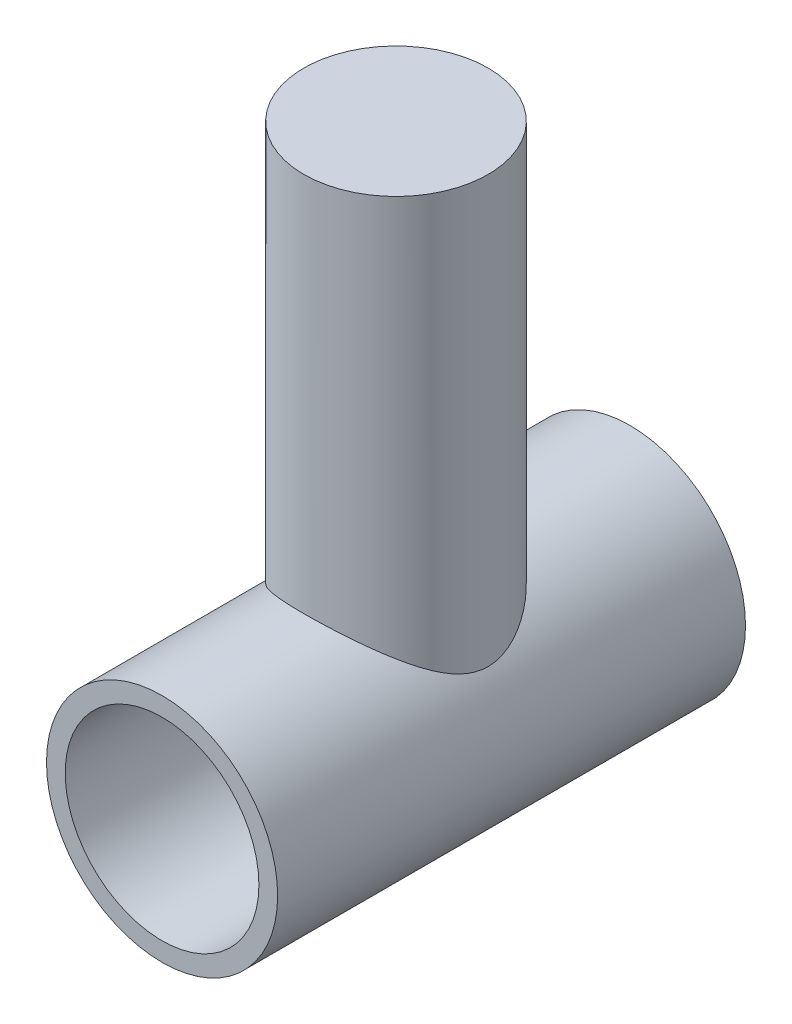
ISO-10303-21;
HEADER;
FILE_DESCRIPTION(('STEP AP214'),'2;1');
FILE_NAME('part.step','',(''),(''),'','','');
FILE_SCHEMA(('AUTOMOTIVE_DESIGN { 1 0 10303 214 1 1 1 1 }'));
ENDSEC;
DATA;
#1=APPLICATION_CONTEXT('core data for automotive mechanical design processes');
#2=APPLICATION_PROTOCOL_DEFINITION('international standard','automotive_design',2000,#1);
#3=PRODUCT_CONTEXT('',#1,'mechanical');
#4=PRODUCT('Part','Part','',(#3));
#5=PRODUCT_RELATED_PRODUCT_CATEGORY('part','',(#4));
#6=PRODUCT_DEFINITION_FORMATION('','',#4);
#7=PRODUCT_DEFINITION_CONTEXT('part definition',#1,'design');
#8=PRODUCT_DEFINITION('design','',#6,#7);
#9=PRODUCT_DEFINITION_SHAPE('','',#8);
#10=(LENGTH_UNIT() NAMED_UNIT(*) SI_UNIT(.MILLI.,.METRE.));
#11=(NAMED_UNIT(*) PLANE_ANGLE_UNIT() SI_UNIT($,.RADIAN.));
#12=(NAMED_UNIT(*) SI_UNIT($,.STERADIAN.) SOLID_ANGLE_UNIT());
#13=UNCERTAINTY_MEASURE_WITH_UNIT(LENGTH_MEASURE(1.E-05),#10,'distance_accuracy_value','');
#14=(GEOMETRIC_REPRESENTATION_CONTEXT(3) GLOBAL_UNCERTAINTY_ASSIGNED_CONTEXT((#13)) GLOBAL_UNIT_ASSIGNED_CONTEXT((#10,
#11,#12)) REPRESENTATION_CONTEXT('',''));
#15=CARTESIAN_POINT('',(0.,0.,0.));
#16=DIRECTION('',(0.,0.,1.));
#17=DIRECTION('',(1.,0.,0.));
#18=AXIS2_PLACEMENT_3D('',#15,#16,#17);
#19=CARTESIAN_POINT('',(0.,0.,50.));
#20=DIRECTION('',(0.,0.,-1.));
#21=DIRECTION('',(-1.,0.,0.));
#22=AXIS2_PLACEMENT_3D('',#19,#20,#21);
#23=CYLINDRICAL_SURFACE('',#22,12.35);
#24=CARTESIAN_POINT('',(0.,0.,0.));
#25=DIRECTION('',(0.,0.,1.));
#26=DIRECTION('',(1.,0.,0.));
#27=AXIS2_PLACEMENT_3D('',#24,#25,#26);
#28=CIRCLE('',#27,12.35);
#29=CARTESIAN_POINT('',(12.35,0.,0.));
#30=VERTEX_POINT('',#29);
#31=EDGE_CURVE('E47',#30,#30,#28,.T.);
#32=ORIENTED_EDGE('',*,*,#31,.T.);
#33=EDGE_LOOP('',(#32));
#34=FACE_BOUND('',#33,.T.);
#35=CARTESIAN_POINT('',(0.,0.,50.));
#36=DIRECTION('',(0.,0.,1.));
#37=DIRECTION('',(1.,0.,0.));
#38=AXIS2_PLACEMENT_3D('',#35,#36,#37);
#39=CIRCLE('',#38,12.35);
#40=CARTESIAN_POINT('',(12.35,0.,50.));
#41=VERTEX_POINT('',#40);
#42=EDGE_CURVE('E10',#41,#41,#39,.T.);
#43=ORIENTED_EDGE('',*,*,#42,.F.);
#44=EDGE_LOOP('',(#43));
#45=FACE_BOUND('',#44,.T.);
#46=CARTESIAN_POINT('',(-5.61449018166385,11.,16.9067929718807));
#47=CARTESIAN_POINT('',(-5.42529884462076,11.0965659191059,16.775545593569));
#48=CARTESIAN_POINT('',(-5.23040180942077,11.189887363234,16.6501642091318));
#49=CARTESIAN_POINT('',(-4.82956744128013,11.3686369387872,16.4120963111281));
#50=CARTESIAN_POINT('',(-4.62363254186824,11.4540667988581,16.2994070161772));
#51=CARTESIAN_POINT('',(-4.20106512415321,11.6157123763994,16.0876797902694));
#52=CARTESIAN_POINT('',(-3.98442183374415,11.6919185382293,15.9886560019802));
#53=CARTESIAN_POINT('',(-3.54159783676067,11.8335788622985,15.805602377793));
#54=CARTESIAN_POINT('',(-3.31542173211603,11.899038139508,15.7215654072805));
#55=CARTESIAN_POINT('',(-2.85282311895951,12.01837724565,15.5690049152559));
#56=CARTESIAN_POINT('',(-2.61633454077865,12.0721629442987,15.5006072818591));
#57=CARTESIAN_POINT('',(-2.13634196467337,12.1662789617796,15.3812843903192));
#58=CARTESIAN_POINT('',(-1.89283785732801,12.2066090706219,15.3303594048565));
#59=CARTESIAN_POINT('',(-1.40097559945029,12.2727862032871,15.246953011403));
#60=CARTESIAN_POINT('',(-1.15262221851111,12.2986467828771,15.214454340352));
#61=CARTESIAN_POINT('',(-0.653063901700054,12.3352627249628,15.1684740728923));
#62=CARTESIAN_POINT('',(-0.401859289439666,12.3460197847457,15.1549903396425));
#63=CARTESIAN_POINT('',(0.075055382102793,12.3518316615819,15.1477035699446));
#64=CARTESIAN_POINT('',(0.300721546142662,12.3483921513447,15.1520133832037));
#65=CARTESIAN_POINT('',(0.750692025383289,12.3292197570843,15.1760642526019));
#66=CARTESIAN_POINT('',(0.974996434738754,12.3134877329768,15.1958042293327));
#67=CARTESIAN_POINT('',(1.42066414387696,12.2700598226745,15.2504030333168));
#68=CARTESIAN_POINT('',(1.64202624918778,12.2423592218842,15.2852678184726));
#69=CARTESIAN_POINT('',(2.08019498335459,12.1755659376409,15.3695759635973));
#70=CARTESIAN_POINT('',(2.29700160632332,12.1364732394663,15.4190193424054));
#71=CARTESIAN_POINT('',(2.72016574135288,12.0486059018783,15.5305724290574));
#72=CARTESIAN_POINT('',(2.9266474929623,12.0000555669163,15.5923894654104));
#73=CARTESIAN_POINT('',(3.33303462695444,11.893591701106,15.728574698424));
#74=CARTESIAN_POINT('',(3.53293722524407,11.835674266177,15.8029481289898));
#75=CARTESIAN_POINT('',(3.92500871561237,11.711492068565,15.9633182321825));
#76=CARTESIAN_POINT('',(4.11718698907807,11.6452378617705,16.049300216116));
#77=CARTESIAN_POINT('',(4.4934737090355,11.5052809735013,16.2321636608777));
#78=CARTESIAN_POINT('',(4.67758190279591,11.4315780589934,16.3290454627179));
#79=CARTESIAN_POINT('',(4.98821381301977,11.2986932263354,16.5051289948805));
#80=CARTESIAN_POINT('',(5.11675139651109,11.2410312683206,16.5819489474599));
#81=CARTESIAN_POINT('',(5.3691359662743,11.1226930685172,16.740636198292));
#82=CARTESIAN_POINT('',(5.4929850338618,11.0620181925379,16.8225012135127));
#83=CARTESIAN_POINT('',(5.86640750597774,10.8714173234177,17.0815555610705));
#84=CARTESIAN_POINT('',(6.10824926414197,10.7370602705407,17.2667497406506));
#85=CARTESIAN_POINT('',(6.57126706604069,10.4601061850695,17.6561197039602));
#86=CARTESIAN_POINT('',(6.79242620450919,10.3175025634376,17.8603107478169));
#87=CARTESIAN_POINT('',(7.21449290029259,10.0269369222686,18.2870281907644));
#88=CARTESIAN_POINT('',(7.41532006274657,9.87895655222747,18.5096215033638));
#89=CARTESIAN_POINT('',(7.79549632220498,9.58180049758493,18.9715500809506));
#90=CARTESIAN_POINT('',(7.97485281378527,9.43262524350009,19.2108795367034));
#91=CARTESIAN_POINT('',(8.28514863001835,9.16048109872716,19.6668633848377));
#92=CARTESIAN_POINT('',(8.41925931118433,9.03709839716757,19.8811187778695));
#93=CARTESIAN_POINT('',(8.67167705583788,8.79517274563727,20.32143797873));
#94=CARTESIAN_POINT('',(8.78998204648384,8.67663043187328,20.5475033299817));
#95=CARTESIAN_POINT('',(9.00976961553187,8.4481714937969,21.0110014515098));
#96=CARTESIAN_POINT('',(9.11129845921537,8.33823160256654,21.2484005502611));
#97=CARTESIAN_POINT('',(9.2968026055839,8.13088541143018,21.735060765016));
#98=CARTESIAN_POINT('',(9.38078738701135,8.0334723544937,21.9843153858544));
#99=CARTESIAN_POINT('',(9.55344442629555,7.82799846153984,22.5758512110564));
#100=CARTESIAN_POINT('',(9.6351691777975,7.72634478877676,22.9225826719001));
#101=CARTESIAN_POINT('',(9.72966898779226,7.60648489792978,23.4545186059697));
#102=CARTESIAN_POINT('',(9.75647995973291,7.5719794032434,23.6336917288806));
#103=CARTESIAN_POINT('',(9.80030538727324,7.51517231277142,23.9952015899878));
#104=CARTESIAN_POINT('',(9.81732004499943,7.49287046518949,24.177538262831));
#105=CARTESIAN_POINT('',(9.84124327666032,7.46142283978527,24.5453986679092));
#106=CARTESIAN_POINT('',(9.84807500198733,7.45237711183478,24.7309360508201));
#107=CARTESIAN_POINT('',(9.85121875238018,7.44822105202997,25.1022539392181));
#108=CARTESIAN_POINT('',(9.84753111137066,7.45311027782729,25.2880344368008));
#109=CARTESIAN_POINT('',(9.82972292371484,7.47658073138786,25.6583659380241));
#110=CARTESIAN_POINT('',(9.81559377474572,7.49517324868756,25.8429158012263));
#111=CARTESIAN_POINT('',(9.7772315604325,7.54514574390534,26.2092039299484));
#112=CARTESIAN_POINT('',(9.75299701198259,7.57652759881858,26.3909417787046));
#113=CARTESIAN_POINT('',(9.68918717803045,7.65802390164149,26.7859690604752));
#114=CARTESIAN_POINT('',(9.64752870381873,7.71061251098807,26.9984101252857));
#115=CARTESIAN_POINT('',(9.55137654523761,7.82940155713996,27.4165686203542));
#116=CARTESIAN_POINT('',(9.49687286017239,7.89561259461971,27.6222806688744));
#117=CARTESIAN_POINT('',(9.37578743879014,8.03902556419913,28.0268514456266));
#118=CARTESIAN_POINT('',(9.30917125652375,8.11625870301635,28.2256886526426));
#119=CARTESIAN_POINT('',(9.16475977520799,8.27898061366293,28.6156469068967));
#120=CARTESIAN_POINT('',(9.08696748271421,8.36446716316837,28.8067700116978));
#121=CARTESIAN_POINT('',(8.88139509810945,8.58342972114174,29.2701970521377));
#122=CARTESIAN_POINT('',(8.74739034027204,8.72045779817416,29.5380757626032));
#123=CARTESIAN_POINT('',(8.45754606253556,9.00184914896008,30.0577651817319));
#124=CARTESIAN_POINT('',(8.30169507878854,9.14621624836494,30.3095673525731));
#125=CARTESIAN_POINT('',(7.96912408469236,9.43739060921457,30.7967571532569));
#126=CARTESIAN_POINT('',(7.79243729105854,9.58419367451584,31.0321699831371));
#127=CARTESIAN_POINT('',(7.4184324170484,9.87652169598166,31.4865936444383));
#128=CARTESIAN_POINT('',(7.2211253234151,10.0220472884435,31.7056131047536));
#129=CARTESIAN_POINT('',(6.80160119511423,10.3115006041123,32.1310476111339));
#130=CARTESIAN_POINT('',(6.57894610715368,10.4553296843256,32.3370988034759));
#131=CARTESIAN_POINT('',(6.11245453381482,10.7347234013807,32.730029316295));
#132=CARTESIAN_POINT('',(5.86861974304087,10.8702886979399,32.9169101680013));
#133=CARTESIAN_POINT('',(5.42529884462077,11.0965659191059,33.224454406431));
#134=CARTESIAN_POINT('',(5.23040180942078,11.1898873632339,33.3498357908682));
#135=CARTESIAN_POINT('',(4.82956744128014,11.3686369387872,33.5879036888719));
#136=CARTESIAN_POINT('',(4.62363254186826,11.4540667988581,33.7005929838228));
#137=CARTESIAN_POINT('',(4.20106512415323,11.6157123763994,33.9123202097306));
#138=CARTESIAN_POINT('',(3.98442183374416,11.6919185382293,34.0113439980198));
#139=CARTESIAN_POINT('',(3.54159783676069,11.8335788622985,34.194397622207));
#140=CARTESIAN_POINT('',(3.31542173211605,11.899038139508,34.2784345927195));
#141=CARTESIAN_POINT('',(2.85282311895952,12.01837724565,34.4309950847441));
#142=CARTESIAN_POINT('',(2.61633454077867,12.0721629442987,34.4993927181409));
#143=CARTESIAN_POINT('',(2.13634196467339,12.1662789617796,34.6187156096808));
#144=CARTESIAN_POINT('',(1.89283785732803,12.2066090706219,34.6696405951435));
#145=CARTESIAN_POINT('',(1.4009755994503,12.2727862032871,34.753046988597));
#146=CARTESIAN_POINT('',(1.15262221851113,12.2986467828771,34.785545659648));
#147=CARTESIAN_POINT('',(0.653063901700069,12.3352627249628,34.8315259271077));
#148=CARTESIAN_POINT('',(0.401859289439681,12.3460197847457,34.8450096603575));
#149=CARTESIAN_POINT('',(-0.0750553821027777,12.3518316615819,34.8522964300554));
#150=CARTESIAN_POINT('',(-0.300721546142647,12.3483921513447,34.8479866167963));
#151=CARTESIAN_POINT('',(-0.750692025383275,12.3292197570843,34.8239357473981));
#152=CARTESIAN_POINT('',(-0.974996434738739,12.3134877329768,34.8041957706673));
#153=CARTESIAN_POINT('',(-1.42066414387695,12.2700598226745,34.7495969666833));
#154=CARTESIAN_POINT('',(-1.64202624918777,12.2423592218842,34.7147321815274));
#155=CARTESIAN_POINT('',(-2.08019498335458,12.1755659376409,34.6304240364027));
#156=CARTESIAN_POINT('',(-2.29700160632331,12.1364732394663,34.5809806575946));
#157=CARTESIAN_POINT('',(-2.72016574135287,12.0486059018783,34.4694275709426));
#158=CARTESIAN_POINT('',(-2.92664749296229,12.0000555669163,34.4076105345896));
#159=CARTESIAN_POINT('',(-3.33303462695443,11.893591701106,34.271425301576));
#160=CARTESIAN_POINT('',(-3.53293722524406,11.835674266177,34.1970518710102));
#161=CARTESIAN_POINT('',(-3.92500871561236,11.711492068565,34.0366817678175));
#162=CARTESIAN_POINT('',(-4.11718698907806,11.6452378617705,33.950699783884));
#163=CARTESIAN_POINT('',(-4.49347370903549,11.5052809735013,33.7678363391224));
#164=CARTESIAN_POINT('',(-4.6775819027959,11.4315780589934,33.6709545372822));
#165=CARTESIAN_POINT('',(-4.98821381301976,11.2986932263354,33.4948710051195));
#166=CARTESIAN_POINT('',(-5.11675139651108,11.2410312683206,33.4180510525401));
#167=CARTESIAN_POINT('',(-5.36913596627429,11.1226930685172,33.259363801708));
#168=CARTESIAN_POINT('',(-5.49298503386178,11.0620181925379,33.1774987864873));
#169=CARTESIAN_POINT('',(-5.86640750597773,10.8714173234177,32.9184444389295));
#170=CARTESIAN_POINT('',(-6.10824926414196,10.7370602705407,32.7332502593494));
#171=CARTESIAN_POINT('',(-6.57126706604068,10.4601061850695,32.3438802960398));
#172=CARTESIAN_POINT('',(-6.79242620450918,10.3175025634376,32.1396892521831));
#173=CARTESIAN_POINT('',(-7.21449290029259,10.0269369222686,31.7129718092356));
#174=CARTESIAN_POINT('',(-7.41532006274657,9.87895655222747,31.4903784966363));
#175=CARTESIAN_POINT('',(-7.79549632220498,9.58180049758493,31.0284499190494));
#176=CARTESIAN_POINT('',(-7.97485281378527,9.43262524350009,30.7891204632966));
#177=CARTESIAN_POINT('',(-8.28514863001835,9.16048109872716,30.3331366151623));
#178=CARTESIAN_POINT('',(-8.41925931118433,9.03709839716757,30.1188812221305));
#179=CARTESIAN_POINT('',(-8.67167705583788,8.79517274563727,29.67856202127));
#180=CARTESIAN_POINT('',(-8.78998204648383,8.67663043187328,29.4524966700183));
#181=CARTESIAN_POINT('',(-9.00976961553187,8.4481714937969,28.9889985484902));
#182=CARTESIAN_POINT('',(-9.11129845921537,8.33823160256655,28.7515994497389));
#183=CARTESIAN_POINT('',(-9.29680260558389,8.13088541143018,28.264939234984));
#184=CARTESIAN_POINT('',(-9.38078738701135,8.0334723544937,28.0156846141456));
#185=CARTESIAN_POINT('',(-9.55344442629555,7.82799846153984,27.4241487889436));
#186=CARTESIAN_POINT('',(-9.6351691777975,7.72634478877676,27.0774173280999));
#187=CARTESIAN_POINT('',(-9.72966898779226,7.60648489792978,26.5454813940303));
#188=CARTESIAN_POINT('',(-9.75647995973291,7.5719794032434,26.3663082711194));
#189=CARTESIAN_POINT('',(-9.80030538727324,7.51517231277142,26.0047984100122));
#190=CARTESIAN_POINT('',(-9.81732004499943,7.49287046518949,25.822461737169));
#191=CARTESIAN_POINT('',(-9.84124327666032,7.46142283978527,25.4546013320907));
#192=CARTESIAN_POINT('',(-9.84807500198733,7.45237711183478,25.2690639491799));
#193=CARTESIAN_POINT('',(-9.85121875238018,7.44822105202997,24.8977460607819));
#194=CARTESIAN_POINT('',(-9.84753111137066,7.45311027782729,24.7119655631992));
#195=CARTESIAN_POINT('',(-9.82972292371483,7.47658073138786,24.3416340619759));
#196=CARTESIAN_POINT('',(-9.81559377474572,7.49517324868756,24.1570841987737));
#197=CARTESIAN_POINT('',(-9.7772315604325,7.54514574390534,23.7907960700516));
#198=CARTESIAN_POINT('',(-9.75299701198259,7.57652759881858,23.6090582212954));
#199=CARTESIAN_POINT('',(-9.68918717803045,7.65802390164149,23.2140309395248));
#200=CARTESIAN_POINT('',(-9.64752870381873,7.71061251098807,23.0015898747142));
#201=CARTESIAN_POINT('',(-9.55137654523761,7.82940155713997,22.5834313796458));
#202=CARTESIAN_POINT('',(-9.49687286017239,7.89561259461971,22.3777193311256));
#203=CARTESIAN_POINT('',(-9.37578743879014,8.03902556419913,21.9731485543734));
#204=CARTESIAN_POINT('',(-9.30917125652375,8.11625870301636,21.7743113473574));
#205=CARTESIAN_POINT('',(-9.16475977520799,8.27898061366293,21.3843530931033));
#206=CARTESIAN_POINT('',(-9.08696748271421,8.36446716316837,21.1932299883022));
#207=CARTESIAN_POINT('',(-8.88139509810945,8.58342972114174,20.7298029478623));
#208=CARTESIAN_POINT('',(-8.74739034027204,8.72045779817416,20.4619242373968));
#209=CARTESIAN_POINT('',(-8.45754606253556,9.00184914896009,19.9422348182681));
#210=CARTESIAN_POINT('',(-8.30169507878854,9.14621624836495,19.6904326474269));
#211=CARTESIAN_POINT('',(-7.96912408469236,9.43739060921458,19.2032428467431));
#212=CARTESIAN_POINT('',(-7.79243729105853,9.58419367451584,18.9678300168629));
#213=CARTESIAN_POINT('',(-7.4184324170484,9.87652169598167,18.5134063555617));
#214=CARTESIAN_POINT('',(-7.22112532341509,10.0220472884435,18.2943868952464));
#215=CARTESIAN_POINT('',(-6.80160119511422,10.3115006041123,17.8689523888661));
#216=CARTESIAN_POINT('',(-6.57894610715367,10.4553296843256,17.6629011965241));
#217=CARTESIAN_POINT('',(-6.11245453381481,10.7347234013807,17.269970683705));
#218=CARTESIAN_POINT('',(-5.86861974304086,10.8702886979399,17.0830898319987));
#219=CARTESIAN_POINT('',(-5.61449018166385,11.,16.9067929718807));
#220=B_SPLINE_CURVE_WITH_KNOTS('',3,(#46,#47,#48,#49,#50,#51,#52,#53,#54,#55,#56,#57,#58,#59,
#60,#61,#62,#63,#64,#65,#66,#67,#68,#69,#70,#71,#72,#73,#74,#75,#76,#77,#78,#79,#80,#81,#82,#83,
#84,#85,#86,#87,#88,#89,#90,#91,#92,#93,#94,#95,#96,#97,#98,#99,#100,#101,#102,#103,#104,#105,
#106,#107,#108,#109,#110,#111,#112,#113,#114,#115,#116,#117,#118,#119,#120,#121,#122,#123,#124,
#125,#126,#127,#128,#129,#130,#131,#132,#133,#134,#135,#136,#137,#138,#139,#140,#141,#142,#143,
#144,#145,#146,#147,#148,#149,#150,#151,#152,#153,#154,#155,#156,#157,#158,#159,#160,#161,#162,
#163,#164,#165,#166,#167,#168,#169,#170,#171,#172,#173,#174,#175,#176,#177,#178,#179,#180,#181,
#182,#183,#184,#185,#186,#187,#188,#189,#190,#191,#192,#193,#194,#195,#196,#197,#198,#199,#200,
#201,#202,#203,#204,#205,#206,#207,#208,#209,#210,#211,#212,#213,#214,#215,#216,#217,#218,#219),
.UNSPECIFIED.,.T.,.F.,(4,2,2,2,2,2,2,2,2,2,2,2,2,2,2,2,2,2,2,2,2,2,2,2,2,2,2,2,2,2,2,2,2,2,2,2,
2,2,2,2,2,2,2,2,2,2,2,2,2,2,2,2,2,2,2,2,2,2,2,2,2,2,2,2,2,2,2,2,2,2,2,2,2,2,2,2,2,2,2,2,2,2,2,2,
2,2,4),(0.,0.748864202000455,1.49756397491848,2.24703287067838,2.99614401675382,
3.75108800625278,4.50604377696533,5.26029107860815,6.01445361346753,6.69079963461533,
7.36709834659653,8.04366370564661,8.7202299390004,9.38236485466179,10.044776453776,
10.7063576021973,11.3679594546272,11.8491709001829,12.3301661607638,13.3274164110213,
14.3254747827717,15.3273369383949,16.3288530503148,17.1719965690461,18.0152505537507,
18.8561387287419,19.6965714051281,20.803315462581,21.356019083971,21.9087113010655,
22.4655538254577,23.02237867375,23.5796627789435,24.1370287020161,24.8043481238251,
25.4721888165155,26.1419593190841,26.8115499787048,27.7982865032008,28.785542771545,
29.7712458958153,30.7564264776548,31.762411995317,32.7683170973141,33.5171812993146,
34.2658810722326,35.0153499679925,35.7644611140679,36.5194051035669,37.2743608742794,
38.0286081759223,38.7827707107816,39.4591167319294,40.1354154439106,40.8119808029607,
41.4885470363145,42.1506819519759,42.8130935510901,43.4746746995114,44.1362765519413,
44.617487997497,45.0984832580779,46.0957335083354,47.0937918800858,48.095654035709,
49.0971701476289,49.9403136663602,50.7835676510648,51.624455826056,52.4648885024422,
53.5716325598951,54.1243361812851,54.6770283983797,55.2338709227718,55.7906957710641,
56.3479798762576,56.9053457993302,57.5726652211392,58.2405059138296,58.9102764163982,
59.5798670760189,60.5666036005149,61.5538598688592,62.5395629931294,63.524743574969,
64.5307290926311,65.5366341946282),.UNSPECIFIED.);
#221=CARTESIAN_POINT('',(-5.61449018166385,11.,16.9067929718807));
#222=VERTEX_POINT('',#221);
#223=EDGE_CURVE('E62',#222,#222,#220,.T.);
#224=ORIENTED_EDGE('',*,*,#223,.T.);
#225=EDGE_LOOP('',(#224));
#226=FACE_BOUND('',#225,.T.);
#227=ADVANCED_FACE('F43',(#34,#45,#226),#23,.T.);
#228=CARTESIAN_POINT('',(0.,0.,50.));
#229=DIRECTION('',(0.,0.,-1.));
#230=DIRECTION('',(-1.,0.,0.));
#231=AXIS2_PLACEMENT_3D('',#228,#229,#230);
#232=CYLINDRICAL_SURFACE('',#231,10.35);
#233=CARTESIAN_POINT('',(0.,0.,50.));
#234=DIRECTION('',(0.,0.,1.));
#235=DIRECTION('',(1.,0.,0.));
#236=AXIS2_PLACEMENT_3D('',#233,#234,#235);
#237=CIRCLE('',#236,10.35);
#238=CARTESIAN_POINT('',(10.35,0.,50.));
#239=VERTEX_POINT('',#238);
#240=EDGE_CURVE('E56',#239,#239,#237,.T.);
#241=ORIENTED_EDGE('',*,*,#240,.T.);
#242=EDGE_LOOP('',(#241));
#243=FACE_BOUND('',#242,.T.);
#244=CARTESIAN_POINT('',(0.,0.,0.));
#245=DIRECTION('',(0.,0.,1.));
#246=DIRECTION('',(1.,0.,0.));
#247=AXIS2_PLACEMENT_3D('',#244,#245,#246);
#248=CIRCLE('',#247,10.35);
#249=CARTESIAN_POINT('',(10.35,0.,0.));
#250=VERTEX_POINT('',#249);
#251=EDGE_CURVE('E58',#250,#250,#248,.T.);
#252=ORIENTED_EDGE('',*,*,#251,.F.);
#253=EDGE_LOOP('',(#252));
#254=FACE_BOUND('',#253,.T.);
#255=ADVANCED_FACE('F82',(#243,#254),#232,.F.);
#256=CARTESIAN_POINT('',(0.,0.,50.));
#257=DIRECTION('',(0.,0.,1.));
#258=DIRECTION('',(1.,0.,0.));
#259=AXIS2_PLACEMENT_3D('',#256,#257,#258);
#260=PLANE('',#259);
#261=ORIENTED_EDGE('',*,*,#42,.T.);
#262=EDGE_LOOP('',(#261));
#263=FACE_BOUND('',#262,.T.);
#264=ORIENTED_EDGE('',*,*,#240,.F.);
#265=EDGE_LOOP('',(#264));
#266=FACE_BOUND('',#265,.T.);
#267=ADVANCED_FACE('F85',(#263,#266),#260,.T.);
#268=CARTESIAN_POINT('',(0.,0.,0.));
#269=DIRECTION('',(0.,0.,1.));
#270=DIRECTION('',(1.,0.,0.));
#271=AXIS2_PLACEMENT_3D('',#268,#269,#270);
#272=PLANE('',#271);
#273=ORIENTED_EDGE('',*,*,#31,.F.);
#274=EDGE_LOOP('',(#273));
#275=FACE_BOUND('',#274,.T.);
#276=ORIENTED_EDGE('',*,*,#251,.T.);
#277=EDGE_LOOP('',(#276));
#278=FACE_BOUND('',#277,.T.);
#279=ADVANCED_FACE('F80',(#275,#278),#272,.F.);
#280=CARTESIAN_POINT('',(0.,5.,25.));
#281=DIRECTION('',(0.,1.,0.));
#282=DIRECTION('',(0.,0.,1.));
#283=AXIS2_PLACEMENT_3D('',#280,#281,#282);
#284=CYLINDRICAL_SURFACE('',#283,9.85);
#285=ORIENTED_EDGE('',*,*,#223,.F.);
#286=EDGE_LOOP('',(#285));
#287=FACE_BOUND('',#286,.T.);
#288=CARTESIAN_POINT('',(0.,53.,25.));
#289=DIRECTION('',(0.,1.,0.));
#290=DIRECTION('',(0.,0.,1.));
#291=AXIS2_PLACEMENT_3D('',#288,#289,#290);
#292=CIRCLE('',#291,9.85);
#293=CARTESIAN_POINT('',(0.,53.,34.85));
#294=VERTEX_POINT('',#293);
#295=EDGE_CURVE('E73',#294,#294,#292,.T.);
#296=ORIENTED_EDGE('',*,*,#295,.F.);
#297=EDGE_LOOP('',(#296));
#298=FACE_BOUND('',#297,.T.);
#299=ADVANCED_FACE('F74',(#287,#298),#284,.T.);
#300=CARTESIAN_POINT('',(0.,53.,25.));
#301=DIRECTION('',(0.,1.,0.));
#302=DIRECTION('',(0.,0.,1.));
#303=AXIS2_PLACEMENT_3D('',#300,#301,#302);
#304=PLANE('',#303);
#305=ORIENTED_EDGE('',*,*,#295,.T.);
#306=EDGE_LOOP('',(#305));
#307=FACE_BOUND('',#306,.T.);
#308=ADVANCED_FACE('F79',(#307),#304,.T.);
#309=CLOSED_SHELL('',(#227,#255,#267,#279,#299,#308));
#310=MANIFOLD_SOLID_BREP('B2',#309);
#311=ADVANCED_BREP_SHAPE_REPRESENTATION('',(#18,#310),#14);
#312=SHAPE_DEFINITION_REPRESENTATION(#9,#311);
ENDSEC;
END-ISO-10303-21;
